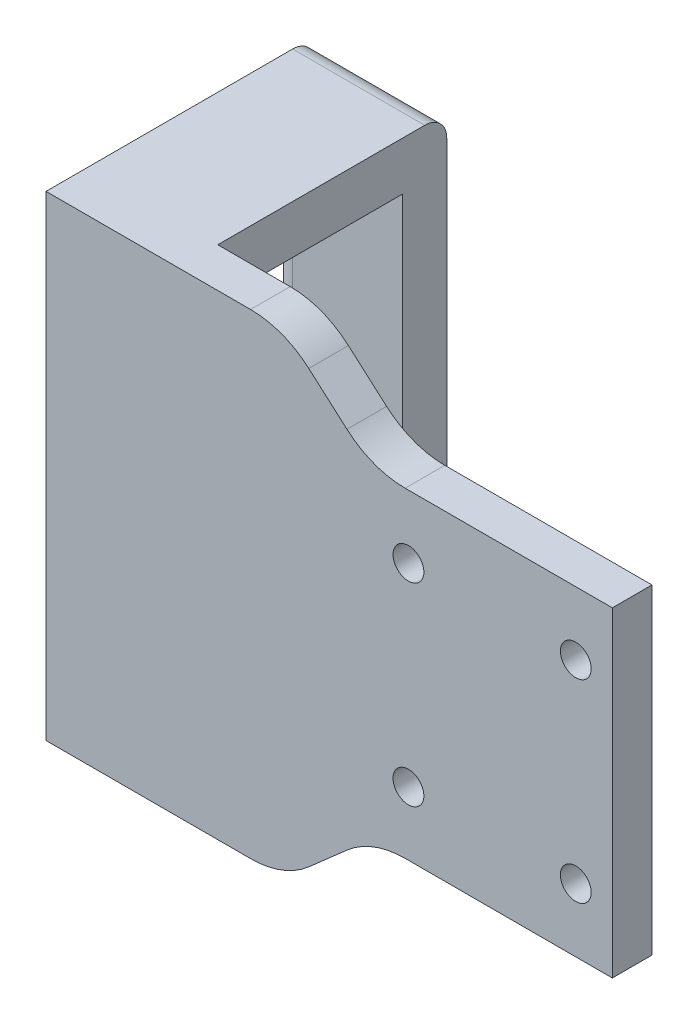
ISO-10303-21;
HEADER;
FILE_DESCRIPTION(('STEP AP214'),'2;1');
FILE_NAME('part.step','',(''),(''),'','','');
FILE_SCHEMA(('AUTOMOTIVE_DESIGN { 1 0 10303 214 1 1 1 1 }'));
ENDSEC;
DATA;
#1=APPLICATION_CONTEXT('core data for automotive mechanical design processes');
#2=APPLICATION_PROTOCOL_DEFINITION('international standard','automotive_design',2000,#1);
#3=PRODUCT_CONTEXT('',#1,'mechanical');
#4=PRODUCT('Part','Part','',(#3));
#5=PRODUCT_RELATED_PRODUCT_CATEGORY('part','',(#4));
#6=PRODUCT_DEFINITION_FORMATION('','',#4);
#7=PRODUCT_DEFINITION_CONTEXT('part definition',#1,'design');
#8=PRODUCT_DEFINITION('design','',#6,#7);
#9=PRODUCT_DEFINITION_SHAPE('','',#8);
#10=(LENGTH_UNIT() NAMED_UNIT(*) SI_UNIT(.MILLI.,.METRE.));
#11=(NAMED_UNIT(*) PLANE_ANGLE_UNIT() SI_UNIT($,.RADIAN.));
#12=(NAMED_UNIT(*) SI_UNIT($,.STERADIAN.) SOLID_ANGLE_UNIT());
#13=UNCERTAINTY_MEASURE_WITH_UNIT(LENGTH_MEASURE(1.E-05),#10,'distance_accuracy_value','');
#14=(GEOMETRIC_REPRESENTATION_CONTEXT(3) GLOBAL_UNCERTAINTY_ASSIGNED_CONTEXT((#13)) GLOBAL_UNIT_ASSIGNED_CONTEXT((#10,
#11,#12)) REPRESENTATION_CONTEXT('',''));
#15=CARTESIAN_POINT('',(0.,0.,0.));
#16=DIRECTION('',(0.,0.,1.));
#17=DIRECTION('',(1.,0.,0.));
#18=AXIS2_PLACEMENT_3D('',#15,#16,#17);
#19=CARTESIAN_POINT('',(-98.5039444560216,-21.5,-21.));
#20=DIRECTION('',(0.,-1.,0.));
#21=DIRECTION('',(0.,0.,-1.));
#22=AXIS2_PLACEMENT_3D('',#19,#20,#21);
#23=PLANE('',#22);
#24=DIRECTION('',(0.,0.,-1.));
#25=VECTOR('',#24,1.);
#26=CARTESIAN_POINT('',(-35.65,-21.5,-21.));
#27=LINE('',#26,#25);
#28=CARTESIAN_POINT('',(-35.65,-21.5,0.));
#29=VERTEX_POINT('',#28);
#30=CARTESIAN_POINT('',(-35.65,-21.5,-5.5));
#31=VERTEX_POINT('',#30);
#32=EDGE_CURVE('E211',#29,#31,#27,.T.);
#33=ORIENTED_EDGE('',*,*,#32,.T.);
#34=DIRECTION('',(-1.,0.,0.));
#35=VECTOR('',#34,1.);
#36=CARTESIAN_POINT('',(-25.4,-21.5,-5.5));
#37=LINE('',#36,#35);
#38=CARTESIAN_POINT('',(-50.65,-21.5,-5.5));
#39=VERTEX_POINT('',#38);
#40=EDGE_CURVE('E198',#31,#39,#37,.T.);
#41=ORIENTED_EDGE('',*,*,#40,.T.);
#42=DIRECTION('',(0.,0.,1.));
#43=VECTOR('',#42,1.);
#44=CARTESIAN_POINT('',(-50.65,-21.5,-21.));
#45=LINE('',#44,#43);
#46=CARTESIAN_POINT('',(-50.65,-21.5,2.5));
#47=VERTEX_POINT('',#46);
#48=EDGE_CURVE('E208',#39,#47,#45,.T.);
#49=ORIENTED_EDGE('',*,*,#48,.T.);
#50=CARTESIAN_POINT('',(-48.15,-21.5,2.5));
#51=DIRECTION('',(0.,-1.,0.));
#52=DIRECTION('',(0.,0.,-1.));
#53=AXIS2_PLACEMENT_3D('',#50,#51,#52);
#54=CIRCLE('',#53,2.5);
#55=CARTESIAN_POINT('',(-48.15,-21.5,0.));
#56=VERTEX_POINT('',#55);
#57=EDGE_CURVE('E11',#47,#56,#54,.T.);
#58=ORIENTED_EDGE('',*,*,#57,.T.);
#59=DIRECTION('',(1.,0.,0.));
#60=VECTOR('',#59,1.);
#61=CARTESIAN_POINT('',(-98.5039444560216,-21.5,0.));
#62=LINE('',#61,#60);
#63=EDGE_CURVE('E226',#56,#29,#62,.T.);
#64=ORIENTED_EDGE('',*,*,#63,.T.);
#65=EDGE_LOOP('',(#33,#41,#49,#58,#64));
#66=FACE_BOUND('',#65,.T.);
#67=ADVANCED_FACE('F35',(#66),#23,.F.);
#68=CARTESIAN_POINT('',(0.,0.,4.5));
#69=DIRECTION('',(0.,0.,-1.));
#70=DIRECTION('',(-1.,0.,0.));
#71=AXIS2_PLACEMENT_3D('',#68,#69,#70);
#72=PLANE('',#71);
#73=DIRECTION('',(1.,0.,0.));
#74=VECTOR('',#73,1.);
#75=CARTESIAN_POINT('',(-23.65,-27.,4.5));
#76=LINE('',#75,#74);
#77=CARTESIAN_POINT('',(-50.65,-27.,4.5));
#78=VERTEX_POINT('',#77);
#79=CARTESIAN_POINT('',(-27.4234780048606,-27.,4.5));
#80=VERTEX_POINT('',#79);
#81=EDGE_CURVE('E280',#78,#80,#76,.T.);
#82=ORIENTED_EDGE('',*,*,#81,.T.);
#83=CARTESIAN_POINT('',(-27.4234780048606,-17.,4.5));
#84=DIRECTION('',(0.,0.,-1.));
#85=DIRECTION('',(-1.,0.,0.));
#86=AXIS2_PLACEMENT_3D('',#83,#84,#85);
#87=CIRCLE('',#86,10.);
#88=CARTESIAN_POINT('',(-20.8171990559404,-24.5071351692275,4.5));
#89=VERTEX_POINT('',#88);
#90=EDGE_CURVE('E330',#80,#89,#87,.F.);
#91=ORIENTED_EDGE('',*,*,#90,.T.);
#92=DIRECTION('',(0.750713516922756,0.660627894892024,0.));
#93=VECTOR('',#92,1.);
#94=CARTESIAN_POINT('',(-13.65,-18.2,4.5));
#95=LINE('',#94,#93);
#96=CARTESIAN_POINT('',(-16.4828009440596,-20.6928648307724,4.5));
#97=VERTEX_POINT('',#96);
#98=EDGE_CURVE('E283',#89,#97,#95,.T.);
#99=ORIENTED_EDGE('',*,*,#98,.T.);
#100=CARTESIAN_POINT('',(-9.87652199513936,-28.2,4.5));
#101=DIRECTION('',(0.,0.,-1.));
#102=DIRECTION('',(-1.,0.,0.));
#103=AXIS2_PLACEMENT_3D('',#100,#101,#102);
#104=CIRCLE('',#103,10.);
#105=CARTESIAN_POINT('',(-9.87652199513936,-18.2,4.5));
#106=VERTEX_POINT('',#105);
#107=EDGE_CURVE('E347',#97,#106,#104,.T.);
#108=ORIENTED_EDGE('',*,*,#107,.T.);
#109=DIRECTION('',(1.,0.,0.));
#110=VECTOR('',#109,1.);
#111=CARTESIAN_POINT('',(-13.65,-18.2,4.5));
#112=LINE('',#111,#110);
#113=CARTESIAN_POINT('',(13.65,-18.2,4.5));
#114=VERTEX_POINT('',#113);
#115=EDGE_CURVE('E286',#106,#114,#112,.T.);
#116=ORIENTED_EDGE('',*,*,#115,.T.);
#117=DIRECTION('',(0.,1.,0.));
#118=VECTOR('',#117,1.);
#119=CARTESIAN_POINT('',(13.65,-18.2,4.5));
#120=LINE('',#119,#118);
#121=CARTESIAN_POINT('',(13.65,18.2,4.5));
#122=VERTEX_POINT('',#121);
#123=EDGE_CURVE('E266',#114,#122,#120,.T.);
#124=ORIENTED_EDGE('',*,*,#123,.T.);
#125=DIRECTION('',(-1.,0.,0.));
#126=VECTOR('',#125,1.);
#127=CARTESIAN_POINT('',(-13.65,18.2,4.5));
#128=LINE('',#127,#126);
#129=CARTESIAN_POINT('',(-9.87652199513936,18.2,4.5));
#130=VERTEX_POINT('',#129);
#131=EDGE_CURVE('E269',#122,#130,#128,.T.);
#132=ORIENTED_EDGE('',*,*,#131,.T.);
#133=CARTESIAN_POINT('',(-9.87652199513936,28.2,4.5));
#134=DIRECTION('',(0.,0.,-1.));
#135=DIRECTION('',(-1.,0.,0.));
#136=AXIS2_PLACEMENT_3D('',#133,#134,#135);
#137=CIRCLE('',#136,10.);
#138=CARTESIAN_POINT('',(-16.4828009440596,20.6928648307725,4.5));
#139=VERTEX_POINT('',#138);
#140=EDGE_CURVE('E351',#130,#139,#137,.T.);
#141=ORIENTED_EDGE('',*,*,#140,.T.);
#142=DIRECTION('',(-0.750713516922755,0.660627894892025,0.));
#143=VECTOR('',#142,1.);
#144=CARTESIAN_POINT('',(-13.65,18.2,4.5));
#145=LINE('',#144,#143);
#146=CARTESIAN_POINT('',(-20.8171990559404,24.5071351692276,4.5));
#147=VERTEX_POINT('',#146);
#148=EDGE_CURVE('E273',#139,#147,#145,.T.);
#149=ORIENTED_EDGE('',*,*,#148,.T.);
#150=CARTESIAN_POINT('',(-27.4234780048607,17.,4.5));
#151=DIRECTION('',(0.,0.,-1.));
#152=DIRECTION('',(-1.,0.,0.));
#153=AXIS2_PLACEMENT_3D('',#150,#151,#152);
#154=CIRCLE('',#153,10.);
#155=CARTESIAN_POINT('',(-27.4234780048607,27.,4.5));
#156=VERTEX_POINT('',#155);
#157=EDGE_CURVE('E328',#147,#156,#154,.F.);
#158=ORIENTED_EDGE('',*,*,#157,.T.);
#159=DIRECTION('',(-1.,0.,0.));
#160=VECTOR('',#159,1.);
#161=CARTESIAN_POINT('',(-23.65,27.,4.5));
#162=LINE('',#161,#160);
#163=CARTESIAN_POINT('',(-50.65,27.,4.5));
#164=VERTEX_POINT('',#163);
#165=EDGE_CURVE('E276',#156,#164,#162,.T.);
#166=ORIENTED_EDGE('',*,*,#165,.T.);
#167=DIRECTION('',(0.,-1.,0.));
#168=VECTOR('',#167,1.);
#169=CARTESIAN_POINT('',(-50.65,27.,4.5));
#170=LINE('',#169,#168);
#171=EDGE_CURVE('E278',#164,#78,#170,.T.);
#172=ORIENTED_EDGE('',*,*,#171,.T.);
#173=EDGE_LOOP('',(#82,#91,#99,#108,#116,#124,#132,#141,#149,#158,#166,#172));
#174=FACE_BOUND('',#173,.T.);
#175=CARTESIAN_POINT('',(-9.5,11.,4.5));
#176=DIRECTION('',(0.,0.,1.));
#177=DIRECTION('',(1.,0.,0.));
#178=AXIS2_PLACEMENT_3D('',#175,#176,#177);
#179=CIRCLE('',#178,1.75);
#180=CARTESIAN_POINT('',(-7.75,11.,4.5));
#181=VERTEX_POINT('',#180);
#182=EDGE_CURVE('E260',#181,#181,#179,.T.);
#183=ORIENTED_EDGE('',*,*,#182,.F.);
#184=EDGE_LOOP('',(#183));
#185=FACE_BOUND('',#184,.T.);
#186=CARTESIAN_POINT('',(9.49999999999999,11.,4.5));
#187=DIRECTION('',(0.,0.,1.));
#188=DIRECTION('',(-1.,0.,0.));
#189=AXIS2_PLACEMENT_3D('',#186,#187,#188);
#190=CIRCLE('',#189,1.75);
#191=CARTESIAN_POINT('',(7.74999999999999,11.,4.5));
#192=VERTEX_POINT('',#191);
#193=EDGE_CURVE('E254',#192,#192,#190,.T.);
#194=ORIENTED_EDGE('',*,*,#193,.F.);
#195=EDGE_LOOP('',(#194));
#196=FACE_BOUND('',#195,.T.);
#197=CARTESIAN_POINT('',(-9.5,-11.,4.5));
#198=DIRECTION('',(0.,0.,1.));
#199=DIRECTION('',(-1.,0.,0.));
#200=AXIS2_PLACEMENT_3D('',#197,#198,#199);
#201=CIRCLE('',#200,1.75);
#202=CARTESIAN_POINT('',(-11.25,-11.,4.5));
#203=VERTEX_POINT('',#202);
#204=EDGE_CURVE('E248',#203,#203,#201,.T.);
#205=ORIENTED_EDGE('',*,*,#204,.F.);
#206=EDGE_LOOP('',(#205));
#207=FACE_BOUND('',#206,.T.);
#208=CARTESIAN_POINT('',(9.49999999999999,-11.,4.5));
#209=DIRECTION('',(0.,0.,1.));
#210=DIRECTION('',(1.,0.,0.));
#211=AXIS2_PLACEMENT_3D('',#208,#209,#210);
#212=CIRCLE('',#211,1.75);
#213=CARTESIAN_POINT('',(11.25,-11.,4.5));
#214=VERTEX_POINT('',#213);
#215=EDGE_CURVE('E242',#214,#214,#212,.T.);
#216=ORIENTED_EDGE('',*,*,#215,.F.);
#217=EDGE_LOOP('',(#216));
#218=FACE_BOUND('',#217,.T.);
#219=ADVANCED_FACE('F437',(#174,#185,#196,#207,#218),#72,.F.);
#220=CARTESIAN_POINT('',(0.,0.,0.));
#221=DIRECTION('',(0.,0.,-1.));
#222=DIRECTION('',(-1.,0.,0.));
#223=AXIS2_PLACEMENT_3D('',#220,#221,#222);
#224=PLANE('',#223);
#225=ORIENTED_EDGE('',*,*,#63,.F.);
#226=DIRECTION('',(0.,1.,0.));
#227=VECTOR('',#226,1.);
#228=CARTESIAN_POINT('',(-48.15,21.5,0.));
#229=LINE('',#228,#227);
#230=CARTESIAN_POINT('',(-48.15,21.5,0.));
#231=VERTEX_POINT('',#230);
#232=EDGE_CURVE('E364',#56,#231,#229,.T.);
#233=ORIENTED_EDGE('',*,*,#232,.T.);
#234=DIRECTION('',(1.,0.,0.));
#235=VECTOR('',#234,1.);
#236=CARTESIAN_POINT('',(-98.5039444560216,21.5,0.));
#237=LINE('',#236,#235);
#238=CARTESIAN_POINT('',(-35.65,21.5,0.));
#239=VERTEX_POINT('',#238);
#240=EDGE_CURVE('E222',#231,#239,#237,.T.);
#241=ORIENTED_EDGE('',*,*,#240,.T.);
#242=DIRECTION('',(0.,-1.,0.));
#243=VECTOR('',#242,1.);
#244=CARTESIAN_POINT('',(-35.65,27.,0.));
#245=LINE('',#244,#243);
#246=CARTESIAN_POINT('',(-35.65,27.,0.));
#247=VERTEX_POINT('',#246);
#248=EDGE_CURVE('E232',#247,#239,#245,.T.);
#249=ORIENTED_EDGE('',*,*,#248,.F.);
#250=DIRECTION('',(-1.,0.,0.));
#251=VECTOR('',#250,1.);
#252=CARTESIAN_POINT('',(-23.65,27.,0.));
#253=LINE('',#252,#251);
#254=CARTESIAN_POINT('',(-27.4234780048607,27.,0.));
#255=VERTEX_POINT('',#254);
#256=EDGE_CURVE('E297',#255,#247,#253,.T.);
#257=ORIENTED_EDGE('',*,*,#256,.F.);
#258=CARTESIAN_POINT('',(-27.4234780048607,17.,0.));
#259=DIRECTION('',(0.,0.,-1.));
#260=DIRECTION('',(-1.,0.,0.));
#261=AXIS2_PLACEMENT_3D('',#258,#259,#260);
#262=CIRCLE('',#261,10.);
#263=CARTESIAN_POINT('',(-20.8171990559404,24.5071351692276,0.));
#264=VERTEX_POINT('',#263);
#265=EDGE_CURVE('E322',#255,#264,#262,.T.);
#266=ORIENTED_EDGE('',*,*,#265,.T.);
#267=DIRECTION('',(-0.750713516922755,0.660627894892025,0.));
#268=VECTOR('',#267,1.);
#269=CARTESIAN_POINT('',(-13.65,18.2,0.));
#270=LINE('',#269,#268);
#271=CARTESIAN_POINT('',(-16.4828009440596,20.6928648307725,0.));
#272=VERTEX_POINT('',#271);
#273=EDGE_CURVE('E294',#272,#264,#270,.T.);
#274=ORIENTED_EDGE('',*,*,#273,.F.);
#275=CARTESIAN_POINT('',(-9.87652199513936,28.2,0.));
#276=DIRECTION('',(0.,0.,-1.));
#277=DIRECTION('',(-1.,0.,0.));
#278=AXIS2_PLACEMENT_3D('',#275,#276,#277);
#279=CIRCLE('',#278,10.);
#280=CARTESIAN_POINT('',(-9.87652199513936,18.2,0.));
#281=VERTEX_POINT('',#280);
#282=EDGE_CURVE('E349',#272,#281,#279,.F.);
#283=ORIENTED_EDGE('',*,*,#282,.T.);
#284=DIRECTION('',(-1.,0.,0.));
#285=VECTOR('',#284,1.);
#286=CARTESIAN_POINT('',(-13.65,18.2,0.));
#287=LINE('',#286,#285);
#288=CARTESIAN_POINT('',(13.65,18.2,0.));
#289=VERTEX_POINT('',#288);
#290=EDGE_CURVE('E291',#289,#281,#287,.T.);
#291=ORIENTED_EDGE('',*,*,#290,.F.);
#292=DIRECTION('',(0.,1.,0.));
#293=VECTOR('',#292,1.);
#294=CARTESIAN_POINT('',(13.65,-18.2,0.));
#295=LINE('',#294,#293);
#296=CARTESIAN_POINT('',(13.65,-18.2,0.));
#297=VERTEX_POINT('',#296);
#298=EDGE_CURVE('E263',#297,#289,#295,.T.);
#299=ORIENTED_EDGE('',*,*,#298,.F.);
#300=DIRECTION('',(1.,0.,0.));
#301=VECTOR('',#300,1.);
#302=CARTESIAN_POINT('',(-13.65,-18.2,0.));
#303=LINE('',#302,#301);
#304=CARTESIAN_POINT('',(-9.87652199513936,-18.2,0.));
#305=VERTEX_POINT('',#304);
#306=EDGE_CURVE('E270',#305,#297,#303,.T.);
#307=ORIENTED_EDGE('',*,*,#306,.F.);
#308=CARTESIAN_POINT('',(-9.87652199513936,-28.2,0.));
#309=DIRECTION('',(0.,0.,-1.));
#310=DIRECTION('',(-1.,0.,0.));
#311=AXIS2_PLACEMENT_3D('',#308,#309,#310);
#312=CIRCLE('',#311,10.);
#313=CARTESIAN_POINT('',(-16.4828009440596,-20.6928648307724,0.));
#314=VERTEX_POINT('',#313);
#315=EDGE_CURVE('E345',#305,#314,#312,.F.);
#316=ORIENTED_EDGE('',*,*,#315,.T.);
#317=DIRECTION('',(0.750713516922756,0.660627894892024,0.));
#318=VECTOR('',#317,1.);
#319=CARTESIAN_POINT('',(-13.65,-18.2,0.));
#320=LINE('',#319,#318);
#321=CARTESIAN_POINT('',(-20.8171990559404,-24.5071351692275,0.));
#322=VERTEX_POINT('',#321);
#323=EDGE_CURVE('E303',#322,#314,#320,.T.);
#324=ORIENTED_EDGE('',*,*,#323,.F.);
#325=CARTESIAN_POINT('',(-27.4234780048606,-17.,0.));
#326=DIRECTION('',(0.,0.,-1.));
#327=DIRECTION('',(-1.,0.,0.));
#328=AXIS2_PLACEMENT_3D('',#325,#326,#327);
#329=CIRCLE('',#328,10.);
#330=CARTESIAN_POINT('',(-27.4234780048606,-27.,0.));
#331=VERTEX_POINT('',#330);
#332=EDGE_CURVE('E324',#322,#331,#329,.T.);
#333=ORIENTED_EDGE('',*,*,#332,.T.);
#334=DIRECTION('',(1.,0.,0.));
#335=VECTOR('',#334,1.);
#336=CARTESIAN_POINT('',(-23.65,-27.,0.));
#337=LINE('',#336,#335);
#338=CARTESIAN_POINT('',(-35.65,-27.,0.));
#339=VERTEX_POINT('',#338);
#340=EDGE_CURVE('E300',#339,#331,#337,.T.);
#341=ORIENTED_EDGE('',*,*,#340,.F.);
#342=EDGE_CURVE('E221',#29,#339,#245,.T.);
#343=ORIENTED_EDGE('',*,*,#342,.F.);
#344=EDGE_LOOP('',(#225,#233,#241,#249,#257,#266,#274,#283,#291,#299,#307,#316,#324,#333,#341,#343));
#345=FACE_BOUND('',#344,.T.);
#346=CARTESIAN_POINT('',(-9.5,-11.,0.));
#347=DIRECTION('',(0.,0.,1.));
#348=DIRECTION('',(-1.,0.,0.));
#349=AXIS2_PLACEMENT_3D('',#346,#347,#348);
#350=CIRCLE('',#349,1.75);
#351=CARTESIAN_POINT('',(-11.25,-11.,0.));
#352=VERTEX_POINT('',#351);
#353=EDGE_CURVE('E245',#352,#352,#350,.T.);
#354=ORIENTED_EDGE('',*,*,#353,.T.);
#355=EDGE_LOOP('',(#354));
#356=FACE_BOUND('',#355,.T.);
#357=CARTESIAN_POINT('',(-9.5,11.,0.));
#358=DIRECTION('',(0.,0.,1.));
#359=DIRECTION('',(1.,0.,0.));
#360=AXIS2_PLACEMENT_3D('',#357,#358,#359);
#361=CIRCLE('',#360,1.75);
#362=CARTESIAN_POINT('',(-7.75,11.,0.));
#363=VERTEX_POINT('',#362);
#364=EDGE_CURVE('E257',#363,#363,#361,.T.);
#365=ORIENTED_EDGE('',*,*,#364,.T.);
#366=EDGE_LOOP('',(#365));
#367=FACE_BOUND('',#366,.T.);
#368=CARTESIAN_POINT('',(9.49999999999999,11.,0.));
#369=DIRECTION('',(0.,0.,1.));
#370=DIRECTION('',(-1.,0.,0.));
#371=AXIS2_PLACEMENT_3D('',#368,#369,#370);
#372=CIRCLE('',#371,1.75);
#373=CARTESIAN_POINT('',(7.74999999999999,11.,0.));
#374=VERTEX_POINT('',#373);
#375=EDGE_CURVE('E251',#374,#374,#372,.T.);
#376=ORIENTED_EDGE('',*,*,#375,.T.);
#377=EDGE_LOOP('',(#376));
#378=FACE_BOUND('',#377,.T.);
#379=CARTESIAN_POINT('',(9.49999999999999,-11.,0.));
#380=DIRECTION('',(0.,0.,1.));
#381=DIRECTION('',(1.,0.,0.));
#382=AXIS2_PLACEMENT_3D('',#379,#380,#381);
#383=CIRCLE('',#382,1.75);
#384=CARTESIAN_POINT('',(11.25,-11.,0.));
#385=VERTEX_POINT('',#384);
#386=EDGE_CURVE('E241',#385,#385,#383,.T.);
#387=ORIENTED_EDGE('',*,*,#386,.T.);
#388=EDGE_LOOP('',(#387));
#389=FACE_BOUND('',#388,.T.);
#390=ADVANCED_FACE('F394',(#345,#356,#367,#378,#389),#224,.T.);
#391=CARTESIAN_POINT('',(13.65,-18.2,4.5));
#392=DIRECTION('',(-1.,0.,0.));
#393=DIRECTION('',(0.,0.,1.));
#394=AXIS2_PLACEMENT_3D('',#391,#392,#393);
#395=PLANE('',#394);
#396=ORIENTED_EDGE('',*,*,#298,.T.);
#397=DIRECTION('',(0.,0.,-1.));
#398=VECTOR('',#397,1.);
#399=CARTESIAN_POINT('',(13.65,18.2,4.5));
#400=LINE('',#399,#398);
#401=EDGE_CURVE('E314',#122,#289,#400,.T.);
#402=ORIENTED_EDGE('',*,*,#401,.F.);
#403=ORIENTED_EDGE('',*,*,#123,.F.);
#404=DIRECTION('',(0.,0.,-1.));
#405=VECTOR('',#404,1.);
#406=CARTESIAN_POINT('',(13.65,-18.2,4.5));
#407=LINE('',#406,#405);
#408=EDGE_CURVE('E288',#114,#297,#407,.T.);
#409=ORIENTED_EDGE('',*,*,#408,.T.);
#410=EDGE_LOOP('',(#396,#402,#403,#409));
#411=FACE_BOUND('',#410,.T.);
#412=ADVANCED_FACE('F449',(#411),#395,.F.);
#413=CARTESIAN_POINT('',(-13.65,18.2,4.5));
#414=DIRECTION('',(0.,-1.,0.));
#415=DIRECTION('',(0.,0.,-1.));
#416=AXIS2_PLACEMENT_3D('',#413,#414,#415);
#417=PLANE('',#416);
#418=ORIENTED_EDGE('',*,*,#290,.T.);
#419=DIRECTION('',(0.,0.,-1.));
#420=VECTOR('',#419,1.);
#421=CARTESIAN_POINT('',(-9.87652199513936,18.2,4.5));
#422=LINE('',#421,#420);
#423=EDGE_CURVE('E343',#281,#130,#422,.F.);
#424=ORIENTED_EDGE('',*,*,#423,.T.);
#425=ORIENTED_EDGE('',*,*,#131,.F.);
#426=ORIENTED_EDGE('',*,*,#401,.T.);
#427=EDGE_LOOP('',(#418,#424,#425,#426));
#428=FACE_BOUND('',#427,.T.);
#429=ADVANCED_FACE('F445',(#428),#417,.F.);
#430=CARTESIAN_POINT('',(-13.65,18.2,4.5));
#431=DIRECTION('',(-0.660627894892025,-0.750713516922755,0.));
#432=DIRECTION('',(0.750713516922755,-0.660627894892025,0.));
#433=AXIS2_PLACEMENT_3D('',#430,#431,#432);
#434=PLANE('',#433);
#435=ORIENTED_EDGE('',*,*,#273,.T.);
#436=DIRECTION('',(0.,0.,-1.));
#437=VECTOR('',#436,1.);
#438=CARTESIAN_POINT('',(-20.8171990559404,24.5071351692276,4.5));
#439=LINE('',#438,#437);
#440=EDGE_CURVE('E338',#264,#147,#439,.F.);
#441=ORIENTED_EDGE('',*,*,#440,.T.);
#442=ORIENTED_EDGE('',*,*,#148,.F.);
#443=DIRECTION('',(0.,0.,-1.));
#444=VECTOR('',#443,1.);
#445=CARTESIAN_POINT('',(-16.4828009440596,20.6928648307725,0.));
#446=LINE('',#445,#444);
#447=EDGE_CURVE('E335',#139,#272,#446,.T.);
#448=ORIENTED_EDGE('',*,*,#447,.T.);
#449=EDGE_LOOP('',(#435,#441,#442,#448));
#450=FACE_BOUND('',#449,.T.);
#451=ADVANCED_FACE('F434',(#450),#434,.F.);
#452=CARTESIAN_POINT('',(-23.65,27.,4.5));
#453=DIRECTION('',(0.,-1.,0.));
#454=DIRECTION('',(1.,0.,0.));
#455=AXIS2_PLACEMENT_3D('',#452,#453,#454);
#456=PLANE('',#455);
#457=DIRECTION('',(0.,0.,1.));
#458=VECTOR('',#457,1.);
#459=CARTESIAN_POINT('',(-35.65,27.,-26.));
#460=LINE('',#459,#458);
#461=CARTESIAN_POINT('',(-35.65,27.,-23.5));
#462=VERTEX_POINT('',#461);
#463=EDGE_CURVE('E239',#462,#247,#460,.T.);
#464=ORIENTED_EDGE('',*,*,#463,.F.);
#465=DIRECTION('',(1.,0.,0.));
#466=VECTOR('',#465,1.);
#467=CARTESIAN_POINT('',(-23.65,27.,-23.5));
#468=LINE('',#467,#466);
#469=CARTESIAN_POINT('',(-50.65,27.,-23.5));
#470=VERTEX_POINT('',#469);
#471=EDGE_CURVE('E376',#462,#470,#468,.F.);
#472=ORIENTED_EDGE('',*,*,#471,.T.);
#473=DIRECTION('',(0.,0.,-1.));
#474=VECTOR('',#473,1.);
#475=CARTESIAN_POINT('',(-50.65,27.,4.5));
#476=LINE('',#475,#474);
#477=EDGE_CURVE('E311',#164,#470,#476,.T.);
#478=ORIENTED_EDGE('',*,*,#477,.F.);
#479=ORIENTED_EDGE('',*,*,#165,.F.);
#480=DIRECTION('',(0.,0.,-1.));
#481=VECTOR('',#480,1.);
#482=CARTESIAN_POINT('',(-27.4234780048607,27.,4.5));
#483=LINE('',#482,#481);
#484=EDGE_CURVE('E332',#156,#255,#483,.T.);
#485=ORIENTED_EDGE('',*,*,#484,.T.);
#486=ORIENTED_EDGE('',*,*,#256,.T.);
#487=EDGE_LOOP('',(#464,#472,#478,#479,#485,#486));
#488=FACE_BOUND('',#487,.T.);
#489=ADVANCED_FACE('F423',(#488),#456,.F.);
#490=CARTESIAN_POINT('',(-50.65,27.,4.5));
#491=DIRECTION('',(1.,0.,0.));
#492=DIRECTION('',(0.,0.,-1.));
#493=AXIS2_PLACEMENT_3D('',#490,#491,#492);
#494=PLANE('',#493);
#495=CARTESIAN_POINT('',(-50.65,-24.75,-15.5));
#496=DIRECTION('',(-1.,0.,0.));
#497=DIRECTION('',(0.,0.,-1.));
#498=AXIS2_PLACEMENT_3D('',#495,#496,#497);
#499=CIRCLE('',#498,1.35);
#500=CARTESIAN_POINT('',(-50.65,-24.75,-16.85));
#501=VERTEX_POINT('',#500);
#502=EDGE_CURVE('E482',#501,#501,#499,.T.);
#503=ORIENTED_EDGE('',*,*,#502,.F.);
#504=EDGE_LOOP('',(#503));
#505=FACE_BOUND('',#504,.T.);
#506=CARTESIAN_POINT('',(-50.65,-24.75,-5.50000000000001));
#507=DIRECTION('',(-1.,0.,0.));
#508=DIRECTION('',(0.,0.,1.));
#509=AXIS2_PLACEMENT_3D('',#506,#507,#508);
#510=CIRCLE('',#509,1.35);
#511=CARTESIAN_POINT('',(-50.65,-24.75,-4.15000000000001));
#512=VERTEX_POINT('',#511);
#513=EDGE_CURVE('E488',#512,#512,#510,.T.);
#514=ORIENTED_EDGE('',*,*,#513,.F.);
#515=EDGE_LOOP('',(#514));
#516=FACE_BOUND('',#515,.T.);
#517=CARTESIAN_POINT('',(-50.65,24.75,-5.50000000000001));
#518=DIRECTION('',(-1.,0.,0.));
#519=DIRECTION('',(0.,0.,-1.));
#520=AXIS2_PLACEMENT_3D('',#517,#518,#519);
#521=CIRCLE('',#520,1.35);
#522=CARTESIAN_POINT('',(-50.65,24.75,-6.85));
#523=VERTEX_POINT('',#522);
#524=EDGE_CURVE('E494',#523,#523,#521,.T.);
#525=ORIENTED_EDGE('',*,*,#524,.F.);
#526=EDGE_LOOP('',(#525));
#527=FACE_BOUND('',#526,.T.);
#528=CARTESIAN_POINT('',(-50.65,24.75,-15.5));
#529=DIRECTION('',(-1.,0.,0.));
#530=DIRECTION('',(0.,0.,1.));
#531=AXIS2_PLACEMENT_3D('',#528,#529,#530);
#532=CIRCLE('',#531,1.35);
#533=CARTESIAN_POINT('',(-50.65,24.75,-14.15));
#534=VERTEX_POINT('',#533);
#535=EDGE_CURVE('E476',#534,#534,#532,.T.);
#536=ORIENTED_EDGE('',*,*,#535,.F.);
#537=EDGE_LOOP('',(#536));
#538=FACE_BOUND('',#537,.T.);
#539=CARTESIAN_POINT('',(-50.65,-21.5,-23.5));
#540=VERTEX_POINT('',#539);
#541=CARTESIAN_POINT('',(-50.65,-21.5,-15.5));
#542=VERTEX_POINT('',#541);
#543=EDGE_CURVE('E218',#540,#542,#45,.T.);
#544=ORIENTED_EDGE('',*,*,#543,.F.);
#545=DIRECTION('',(0.,-1.,0.));
#546=VECTOR('',#545,1.);
#547=CARTESIAN_POINT('',(-50.65,27.,-23.5));
#548=LINE('',#547,#546);
#549=CARTESIAN_POINT('',(-50.65,21.5,-23.5));
#550=VERTEX_POINT('',#549);
#551=EDGE_CURVE('E361',#540,#550,#548,.F.);
#552=ORIENTED_EDGE('',*,*,#551,.T.);
#553=DIRECTION('',(0.,0.,-1.));
#554=VECTOR('',#553,1.);
#555=CARTESIAN_POINT('',(-50.65,21.5,-21.));
#556=LINE('',#555,#554);
#557=CARTESIAN_POINT('',(-50.65,21.5,2.5));
#558=VERTEX_POINT('',#557);
#559=EDGE_CURVE('E219',#558,#550,#556,.T.);
#560=ORIENTED_EDGE('',*,*,#559,.F.);
#561=DIRECTION('',(0.,1.,0.));
#562=VECTOR('',#561,1.);
#563=CARTESIAN_POINT('',(-50.65,-21.5,2.5));
#564=LINE('',#563,#562);
#565=EDGE_CURVE('E216',#558,#47,#564,.F.);
#566=ORIENTED_EDGE('',*,*,#565,.T.);
#567=ORIENTED_EDGE('',*,*,#48,.F.);
#568=CARTESIAN_POINT('',(-50.65,-17.0694444444444,-10.5));
#569=DIRECTION('',(-1.,0.,0.));
#570=DIRECTION('',(0.,0.,1.));
#571=AXIS2_PLACEMENT_3D('',#568,#569,#570);
#572=CIRCLE('',#571,6.68055555555555);
#573=EDGE_CURVE('E195',#542,#39,#572,.T.);
#574=ORIENTED_EDGE('',*,*,#573,.F.);
#575=EDGE_LOOP('',(#544,#552,#560,#566,#567,#574));
#576=FACE_BOUND('',#575,.T.);
#577=ORIENTED_EDGE('',*,*,#477,.T.);
#578=CARTESIAN_POINT('',(-50.65,24.5,-23.5));
#579=DIRECTION('',(1.,0.,0.));
#580=DIRECTION('',(0.,0.,-1.));
#581=AXIS2_PLACEMENT_3D('',#578,#579,#580);
#582=CIRCLE('',#581,2.5);
#583=CARTESIAN_POINT('',(-50.65,24.5,-26.));
#584=VERTEX_POINT('',#583);
#585=EDGE_CURVE('E358',#470,#584,#582,.F.);
#586=ORIENTED_EDGE('',*,*,#585,.T.);
#587=DIRECTION('',(0.,1.,0.));
#588=VECTOR('',#587,1.);
#589=CARTESIAN_POINT('',(-50.65,27.,-26.));
#590=LINE('',#589,#588);
#591=CARTESIAN_POINT('',(-50.65,-24.5,-26.));
#592=VERTEX_POINT('',#591);
#593=EDGE_CURVE('E228',#592,#584,#590,.T.);
#594=ORIENTED_EDGE('',*,*,#593,.F.);
#595=CARTESIAN_POINT('',(-50.65,-24.5,-23.5));
#596=DIRECTION('',(1.,0.,0.));
#597=DIRECTION('',(0.,0.,-1.));
#598=AXIS2_PLACEMENT_3D('',#595,#596,#597);
#599=CIRCLE('',#598,2.5);
#600=CARTESIAN_POINT('',(-50.65,-27.,-23.5));
#601=VERTEX_POINT('',#600);
#602=EDGE_CURVE('E356',#592,#601,#599,.F.);
#603=ORIENTED_EDGE('',*,*,#602,.T.);
#604=DIRECTION('',(0.,0.,-1.));
#605=VECTOR('',#604,1.);
#606=CARTESIAN_POINT('',(-50.65,-27.,4.5));
#607=LINE('',#606,#605);
#608=EDGE_CURVE('E309',#78,#601,#607,.T.);
#609=ORIENTED_EDGE('',*,*,#608,.F.);
#610=ORIENTED_EDGE('',*,*,#171,.F.);
#611=EDGE_LOOP('',(#577,#586,#594,#603,#609,#610));
#612=FACE_BOUND('',#611,.T.);
#613=ADVANCED_FACE('F213',(#505,#516,#527,#538,#576,#612),#494,.F.);
#614=CARTESIAN_POINT('',(-23.65,-27.,4.5));
#615=DIRECTION('',(0.,1.,0.));
#616=DIRECTION('',(-1.,0.,0.));
#617=AXIS2_PLACEMENT_3D('',#614,#615,#616);
#618=PLANE('',#617);
#619=ORIENTED_EDGE('',*,*,#608,.T.);
#620=DIRECTION('',(-1.,0.,0.));
#621=VECTOR('',#620,1.);
#622=CARTESIAN_POINT('',(-23.65,-27.,-23.5));
#623=LINE('',#622,#621);
#624=CARTESIAN_POINT('',(-35.65,-27.,-23.5));
#625=VERTEX_POINT('',#624);
#626=EDGE_CURVE('E58',#601,#625,#623,.F.);
#627=ORIENTED_EDGE('',*,*,#626,.T.);
#628=DIRECTION('',(0.,0.,1.));
#629=VECTOR('',#628,1.);
#630=CARTESIAN_POINT('',(-35.65,-27.,-26.));
#631=LINE('',#630,#629);
#632=EDGE_CURVE('E235',#625,#339,#631,.T.);
#633=ORIENTED_EDGE('',*,*,#632,.T.);
#634=ORIENTED_EDGE('',*,*,#340,.T.);
#635=DIRECTION('',(0.,0.,-1.));
#636=VECTOR('',#635,1.);
#637=CARTESIAN_POINT('',(-27.4234780048606,-27.,4.5));
#638=LINE('',#637,#636);
#639=EDGE_CURVE('E326',#331,#80,#638,.F.);
#640=ORIENTED_EDGE('',*,*,#639,.T.);
#641=ORIENTED_EDGE('',*,*,#81,.F.);
#642=EDGE_LOOP('',(#619,#627,#633,#634,#640,#641));
#643=FACE_BOUND('',#642,.T.);
#644=ADVANCED_FACE('F470',(#643),#618,.F.);
#645=CARTESIAN_POINT('',(-13.65,-18.2,4.5));
#646=DIRECTION('',(-0.660627894892024,0.750713516922756,0.));
#647=DIRECTION('',(-0.750713516922756,-0.660627894892024,0.));
#648=AXIS2_PLACEMENT_3D('',#645,#646,#647);
#649=PLANE('',#648);
#650=ORIENTED_EDGE('',*,*,#98,.F.);
#651=DIRECTION('',(0.,0.,-1.));
#652=VECTOR('',#651,1.);
#653=CARTESIAN_POINT('',(-20.8171990559404,-24.5071351692275,4.5));
#654=LINE('',#653,#652);
#655=EDGE_CURVE('E319',#89,#322,#654,.T.);
#656=ORIENTED_EDGE('',*,*,#655,.T.);
#657=ORIENTED_EDGE('',*,*,#323,.T.);
#658=DIRECTION('',(0.,0.,-1.));
#659=VECTOR('',#658,1.);
#660=CARTESIAN_POINT('',(-16.4828009440596,-20.6928648307724,4.5));
#661=LINE('',#660,#659);
#662=EDGE_CURVE('E317',#314,#97,#661,.F.);
#663=ORIENTED_EDGE('',*,*,#662,.T.);
#664=EDGE_LOOP('',(#650,#656,#657,#663));
#665=FACE_BOUND('',#664,.T.);
#666=ADVANCED_FACE('F463',(#665),#649,.F.);
#667=CARTESIAN_POINT('',(-13.65,-18.2,4.5));
#668=DIRECTION('',(0.,1.,0.));
#669=DIRECTION('',(0.,0.,1.));
#670=AXIS2_PLACEMENT_3D('',#667,#668,#669);
#671=PLANE('',#670);
#672=ORIENTED_EDGE('',*,*,#115,.F.);
#673=DIRECTION('',(0.,0.,-1.));
#674=VECTOR('',#673,1.);
#675=CARTESIAN_POINT('',(-9.87652199513936,-18.2,0.));
#676=LINE('',#675,#674);
#677=EDGE_CURVE('E340',#106,#305,#676,.T.);
#678=ORIENTED_EDGE('',*,*,#677,.T.);
#679=ORIENTED_EDGE('',*,*,#306,.T.);
#680=ORIENTED_EDGE('',*,*,#408,.F.);
#681=EDGE_LOOP('',(#672,#678,#679,#680));
#682=FACE_BOUND('',#681,.T.);
#683=ADVANCED_FACE('F455',(#682),#671,.F.);
#684=CARTESIAN_POINT('',(-9.5,11.,4.5));
#685=DIRECTION('',(0.,0.,-1.));
#686=DIRECTION('',(-1.,0.,0.));
#687=AXIS2_PLACEMENT_3D('',#684,#685,#686);
#688=CYLINDRICAL_SURFACE('',#687,1.75);
#689=ORIENTED_EDGE('',*,*,#182,.T.);
#690=EDGE_LOOP('',(#689));
#691=FACE_BOUND('',#690,.T.);
#692=ORIENTED_EDGE('',*,*,#364,.F.);
#693=EDGE_LOOP('',(#692));
#694=FACE_BOUND('',#693,.T.);
#695=ADVANCED_FACE('F777',(#691,#694),#688,.F.);
#696=CARTESIAN_POINT('',(9.49999999999999,11.,4.5));
#697=DIRECTION('',(0.,0.,-1.));
#698=DIRECTION('',(-1.,0.,0.));
#699=AXIS2_PLACEMENT_3D('',#696,#697,#698);
#700=CYLINDRICAL_SURFACE('',#699,1.75);
#701=ORIENTED_EDGE('',*,*,#193,.T.);
#702=EDGE_LOOP('',(#701));
#703=FACE_BOUND('',#702,.T.);
#704=ORIENTED_EDGE('',*,*,#375,.F.);
#705=EDGE_LOOP('',(#704));
#706=FACE_BOUND('',#705,.T.);
#707=ADVANCED_FACE('F796',(#703,#706),#700,.F.);
#708=CARTESIAN_POINT('',(-9.5,-11.,4.5));
#709=DIRECTION('',(0.,0.,-1.));
#710=DIRECTION('',(-1.,0.,0.));
#711=AXIS2_PLACEMENT_3D('',#708,#709,#710);
#712=CYLINDRICAL_SURFACE('',#711,1.75);
#713=ORIENTED_EDGE('',*,*,#204,.T.);
#714=EDGE_LOOP('',(#713));
#715=FACE_BOUND('',#714,.T.);
#716=ORIENTED_EDGE('',*,*,#353,.F.);
#717=EDGE_LOOP('',(#716));
#718=FACE_BOUND('',#717,.T.);
#719=ADVANCED_FACE('F804',(#715,#718),#712,.F.);
#720=CARTESIAN_POINT('',(9.49999999999999,-11.,4.5));
#721=DIRECTION('',(0.,0.,-1.));
#722=DIRECTION('',(-1.,0.,0.));
#723=AXIS2_PLACEMENT_3D('',#720,#721,#722);
#724=CYLINDRICAL_SURFACE('',#723,1.75);
#725=ORIENTED_EDGE('',*,*,#215,.T.);
#726=EDGE_LOOP('',(#725));
#727=FACE_BOUND('',#726,.T.);
#728=ORIENTED_EDGE('',*,*,#386,.F.);
#729=EDGE_LOOP('',(#728));
#730=FACE_BOUND('',#729,.T.);
#731=ADVANCED_FACE('F644',(#727,#730),#724,.F.);
#732=CARTESIAN_POINT('',(-35.65,27.,-26.));
#733=DIRECTION('',(-1.,0.,0.));
#734=DIRECTION('',(0.,-1.,0.));
#735=AXIS2_PLACEMENT_3D('',#732,#733,#734);
#736=PLANE('',#735);
#737=DIRECTION('',(0.,-1.,0.));
#738=VECTOR('',#737,1.);
#739=CARTESIAN_POINT('',(-35.65,27.,-26.));
#740=LINE('',#739,#738);
#741=CARTESIAN_POINT('',(-35.65,24.5,-26.));
#742=VERTEX_POINT('',#741);
#743=CARTESIAN_POINT('',(-35.65,-24.5,-26.));
#744=VERTEX_POINT('',#743);
#745=EDGE_CURVE('E231',#742,#744,#740,.T.);
#746=ORIENTED_EDGE('',*,*,#745,.F.);
#747=CARTESIAN_POINT('',(-35.65,24.5,-23.5));
#748=DIRECTION('',(-1.,0.,0.));
#749=DIRECTION('',(0.,-1.,0.));
#750=AXIS2_PLACEMENT_3D('',#747,#748,#749);
#751=CIRCLE('',#750,2.5);
#752=EDGE_CURVE('E50',#742,#462,#751,.F.);
#753=ORIENTED_EDGE('',*,*,#752,.T.);
#754=ORIENTED_EDGE('',*,*,#463,.T.);
#755=ORIENTED_EDGE('',*,*,#248,.T.);
#756=DIRECTION('',(0.,0.,1.));
#757=VECTOR('',#756,1.);
#758=CARTESIAN_POINT('',(-35.65,21.5,-21.));
#759=LINE('',#758,#757);
#760=CARTESIAN_POINT('',(-35.65,21.5,-21.));
#761=VERTEX_POINT('',#760);
#762=EDGE_CURVE('E399',#761,#239,#759,.T.);
#763=ORIENTED_EDGE('',*,*,#762,.F.);
#764=DIRECTION('',(0.,1.,0.));
#765=VECTOR('',#764,1.);
#766=CARTESIAN_POINT('',(-35.65,-21.5,-21.));
#767=LINE('',#766,#765);
#768=CARTESIAN_POINT('',(-35.65,-21.5,-21.));
#769=VERTEX_POINT('',#768);
#770=EDGE_CURVE('E401',#769,#761,#767,.T.);
#771=ORIENTED_EDGE('',*,*,#770,.F.);
#772=CARTESIAN_POINT('',(-35.65,-21.5,-15.5));
#773=VERTEX_POINT('',#772);
#774=EDGE_CURVE('E473',#773,#769,#27,.T.);
#775=ORIENTED_EDGE('',*,*,#774,.F.);
#776=CARTESIAN_POINT('',(-35.65,-17.0694444444444,-10.5));
#777=DIRECTION('',(-1.,0.,0.));
#778=DIRECTION('',(0.,-1.,0.));
#779=AXIS2_PLACEMENT_3D('',#776,#777,#778);
#780=CIRCLE('',#779,6.68055555555555);
#781=EDGE_CURVE('E472',#31,#773,#780,.F.);
#782=ORIENTED_EDGE('',*,*,#781,.F.);
#783=ORIENTED_EDGE('',*,*,#32,.F.);
#784=ORIENTED_EDGE('',*,*,#342,.T.);
#785=ORIENTED_EDGE('',*,*,#632,.F.);
#786=CARTESIAN_POINT('',(-35.65,-24.5,-23.5));
#787=DIRECTION('',(-1.,0.,0.));
#788=DIRECTION('',(0.,-1.,0.));
#789=AXIS2_PLACEMENT_3D('',#786,#787,#788);
#790=CIRCLE('',#789,2.5);
#791=EDGE_CURVE('E373',#625,#744,#790,.F.);
#792=ORIENTED_EDGE('',*,*,#791,.T.);
#793=EDGE_LOOP('',(#746,#753,#754,#755,#763,#771,#775,#782,#783,#784,#785,#792));
#794=FACE_BOUND('',#793,.T.);
#795=ADVANCED_FACE('F418',(#794),#736,.F.);
#796=CARTESIAN_POINT('',(0.,0.,-26.));
#797=DIRECTION('',(0.,0.,1.));
#798=DIRECTION('',(1.,0.,0.));
#799=AXIS2_PLACEMENT_3D('',#796,#797,#798);
#800=PLANE('',#799);
#801=ORIENTED_EDGE('',*,*,#593,.T.);
#802=DIRECTION('',(1.,0.,0.));
#803=VECTOR('',#802,1.);
#804=CARTESIAN_POINT('',(0.,24.5,-26.));
#805=LINE('',#804,#803);
#806=EDGE_CURVE('E370',#584,#742,#805,.T.);
#807=ORIENTED_EDGE('',*,*,#806,.T.);
#808=ORIENTED_EDGE('',*,*,#745,.T.);
#809=DIRECTION('',(-1.,0.,0.));
#810=VECTOR('',#809,1.);
#811=CARTESIAN_POINT('',(0.,-24.5,-26.));
#812=LINE('',#811,#810);
#813=EDGE_CURVE('E367',#744,#592,#812,.T.);
#814=ORIENTED_EDGE('',*,*,#813,.T.);
#815=EDGE_LOOP('',(#801,#807,#808,#814));
#816=FACE_BOUND('',#815,.T.);
#817=ADVANCED_FACE('F534',(#816),#800,.F.);
#818=CARTESIAN_POINT('',(-98.5039444560216,21.5,-21.));
#819=DIRECTION('',(0.,1.,0.));
#820=DIRECTION('',(0.,0.,1.));
#821=AXIS2_PLACEMENT_3D('',#818,#819,#820);
#822=PLANE('',#821);
#823=ORIENTED_EDGE('',*,*,#559,.T.);
#824=CARTESIAN_POINT('',(-48.15,21.5,-23.5));
#825=DIRECTION('',(0.,1.,0.));
#826=DIRECTION('',(0.,0.,1.));
#827=AXIS2_PLACEMENT_3D('',#824,#825,#826);
#828=CIRCLE('',#827,2.5);
#829=CARTESIAN_POINT('',(-48.15,21.5,-21.));
#830=VERTEX_POINT('',#829);
#831=EDGE_CURVE('E382',#550,#830,#828,.T.);
#832=ORIENTED_EDGE('',*,*,#831,.T.);
#833=DIRECTION('',(1.,0.,0.));
#834=VECTOR('',#833,1.);
#835=CARTESIAN_POINT('',(-98.5039444560216,21.5,-21.));
#836=LINE('',#835,#834);
#837=EDGE_CURVE('E400',#830,#761,#836,.T.);
#838=ORIENTED_EDGE('',*,*,#837,.T.);
#839=ORIENTED_EDGE('',*,*,#762,.T.);
#840=ORIENTED_EDGE('',*,*,#240,.F.);
#841=CARTESIAN_POINT('',(-48.15,21.5,2.5));
#842=DIRECTION('',(0.,1.,0.));
#843=DIRECTION('',(0.,0.,1.));
#844=AXIS2_PLACEMENT_3D('',#841,#842,#843);
#845=CIRCLE('',#844,2.5);
#846=EDGE_CURVE('E43',#231,#558,#845,.T.);
#847=ORIENTED_EDGE('',*,*,#846,.T.);
#848=EDGE_LOOP('',(#823,#832,#838,#839,#840,#847));
#849=FACE_BOUND('',#848,.T.);
#850=ADVANCED_FACE('F386',(#849),#822,.F.);
#851=CARTESIAN_POINT('',(-98.5039444560216,-21.5,-21.));
#852=DIRECTION('',(0.,0.,-1.));
#853=DIRECTION('',(0.,1.,0.));
#854=AXIS2_PLACEMENT_3D('',#851,#852,#853);
#855=PLANE('',#854);
#856=ORIENTED_EDGE('',*,*,#837,.F.);
#857=DIRECTION('',(0.,-1.,0.));
#858=VECTOR('',#857,1.);
#859=CARTESIAN_POINT('',(-48.15,-21.5,-21.));
#860=LINE('',#859,#858);
#861=CARTESIAN_POINT('',(-48.15,-21.5,-21.));
#862=VERTEX_POINT('',#861);
#863=EDGE_CURVE('E353',#830,#862,#860,.T.);
#864=ORIENTED_EDGE('',*,*,#863,.T.);
#865=DIRECTION('',(1.,0.,0.));
#866=VECTOR('',#865,1.);
#867=CARTESIAN_POINT('',(-98.5039444560216,-21.5,-21.));
#868=LINE('',#867,#866);
#869=EDGE_CURVE('E398',#862,#769,#868,.T.);
#870=ORIENTED_EDGE('',*,*,#869,.T.);
#871=ORIENTED_EDGE('',*,*,#770,.T.);
#872=EDGE_LOOP('',(#856,#864,#870,#871));
#873=FACE_BOUND('',#872,.T.);
#874=ADVANCED_FACE('F414',(#873),#855,.F.);
#875=ORIENTED_EDGE('',*,*,#543,.T.);
#876=DIRECTION('',(-1.,0.,0.));
#877=VECTOR('',#876,1.);
#878=CARTESIAN_POINT('',(-25.4,-21.5,-15.5));
#879=LINE('',#878,#877);
#880=EDGE_CURVE('E201',#773,#542,#879,.T.);
#881=ORIENTED_EDGE('',*,*,#880,.F.);
#882=ORIENTED_EDGE('',*,*,#774,.T.);
#883=ORIENTED_EDGE('',*,*,#869,.F.);
#884=CARTESIAN_POINT('',(-48.15,-21.5,-23.5));
#885=DIRECTION('',(0.,-1.,0.));
#886=DIRECTION('',(0.,0.,-1.));
#887=AXIS2_PLACEMENT_3D('',#884,#885,#886);
#888=CIRCLE('',#887,2.5);
#889=EDGE_CURVE('E379',#862,#540,#888,.T.);
#890=ORIENTED_EDGE('',*,*,#889,.T.);
#891=EDGE_LOOP('',(#875,#881,#882,#883,#890));
#892=FACE_BOUND('',#891,.T.);
#893=ADVANCED_FACE('F501',(#892),#23,.F.);
#894=CARTESIAN_POINT('',(-38.65,24.75,-15.5));
#895=DIRECTION('',(-1.,0.,0.));
#896=DIRECTION('',(0.,0.,1.));
#897=AXIS2_PLACEMENT_3D('',#894,#895,#896);
#898=CYLINDRICAL_SURFACE('',#897,1.35);
#899=CARTESIAN_POINT('',(-38.65,24.75,-15.5));
#900=DIRECTION('',(-1.,0.,0.));
#901=DIRECTION('',(0.,0.,1.));
#902=AXIS2_PLACEMENT_3D('',#899,#900,#901);
#903=CIRCLE('',#902,1.35);
#904=CARTESIAN_POINT('',(-38.65,24.75,-14.15));
#905=VERTEX_POINT('',#904);
#906=EDGE_CURVE('E474',#905,#905,#903,.T.);
#907=ORIENTED_EDGE('',*,*,#906,.F.);
#908=EDGE_LOOP('',(#907));
#909=FACE_BOUND('',#908,.T.);
#910=ORIENTED_EDGE('',*,*,#535,.T.);
#911=EDGE_LOOP('',(#910));
#912=FACE_BOUND('',#911,.T.);
#913=ADVANCED_FACE('F523',(#909,#912),#898,.F.);
#914=CARTESIAN_POINT('',(-38.65,24.75,-15.5));
#915=DIRECTION('',(-1.,0.,0.));
#916=DIRECTION('',(0.,0.,1.));
#917=AXIS2_PLACEMENT_3D('',#914,#915,#916);
#918=PLANE('',#917);
#919=ORIENTED_EDGE('',*,*,#906,.T.);
#920=EDGE_LOOP('',(#919));
#921=FACE_BOUND('',#920,.T.);
#922=ADVANCED_FACE('F528',(#921),#918,.T.);
#923=CARTESIAN_POINT('',(-38.65,24.75,-5.50000000000001));
#924=DIRECTION('',(-1.,0.,0.));
#925=DIRECTION('',(0.,0.,1.));
#926=AXIS2_PLACEMENT_3D('',#923,#924,#925);
#927=CYLINDRICAL_SURFACE('',#926,1.35);
#928=CARTESIAN_POINT('',(-38.65,24.75,-5.50000000000001));
#929=DIRECTION('',(-1.,0.,0.));
#930=DIRECTION('',(0.,0.,-1.));
#931=AXIS2_PLACEMENT_3D('',#928,#929,#930);
#932=CIRCLE('',#931,1.35);
#933=CARTESIAN_POINT('',(-38.65,24.75,-6.85));
#934=VERTEX_POINT('',#933);
#935=EDGE_CURVE('E479',#934,#934,#932,.T.);
#936=ORIENTED_EDGE('',*,*,#935,.F.);
#937=EDGE_LOOP('',(#936));
#938=FACE_BOUND('',#937,.T.);
#939=ORIENTED_EDGE('',*,*,#524,.T.);
#940=EDGE_LOOP('',(#939));
#941=FACE_BOUND('',#940,.T.);
#942=ADVANCED_FACE('F539',(#938,#941),#927,.F.);
#943=CARTESIAN_POINT('',(-38.65,24.75,-5.50000000000001));
#944=DIRECTION('',(1.,0.,0.));
#945=DIRECTION('',(0.,0.,-1.));
#946=AXIS2_PLACEMENT_3D('',#943,#944,#945);
#947=PLANE('',#946);
#948=ORIENTED_EDGE('',*,*,#935,.T.);
#949=EDGE_LOOP('',(#948));
#950=FACE_BOUND('',#949,.T.);
#951=ADVANCED_FACE('F553',(#950),#947,.F.);
#952=CARTESIAN_POINT('',(-38.65,-24.75,-5.50000000000001));
#953=DIRECTION('',(-1.,0.,0.));
#954=DIRECTION('',(0.,0.,1.));
#955=AXIS2_PLACEMENT_3D('',#952,#953,#954);
#956=CYLINDRICAL_SURFACE('',#955,1.35);
#957=CARTESIAN_POINT('',(-38.65,-24.75,-5.50000000000001));
#958=DIRECTION('',(-1.,0.,0.));
#959=DIRECTION('',(0.,0.,1.));
#960=AXIS2_PLACEMENT_3D('',#957,#958,#959);
#961=CIRCLE('',#960,1.35);
#962=CARTESIAN_POINT('',(-38.65,-24.75,-4.15000000000001));
#963=VERTEX_POINT('',#962);
#964=EDGE_CURVE('E491',#963,#963,#961,.T.);
#965=ORIENTED_EDGE('',*,*,#964,.F.);
#966=EDGE_LOOP('',(#965));
#967=FACE_BOUND('',#966,.T.);
#968=ORIENTED_EDGE('',*,*,#513,.T.);
#969=EDGE_LOOP('',(#968));
#970=FACE_BOUND('',#969,.T.);
#971=ADVANCED_FACE('F550',(#967,#970),#956,.F.);
#972=CARTESIAN_POINT('',(-38.65,-24.75,-5.50000000000001));
#973=DIRECTION('',(-1.,0.,0.));
#974=DIRECTION('',(0.,0.,1.));
#975=AXIS2_PLACEMENT_3D('',#972,#973,#974);
#976=PLANE('',#975);
#977=ORIENTED_EDGE('',*,*,#964,.T.);
#978=EDGE_LOOP('',(#977));
#979=FACE_BOUND('',#978,.T.);
#980=ADVANCED_FACE('F545',(#979),#976,.T.);
#981=CARTESIAN_POINT('',(-38.65,-24.75,-15.5));
#982=DIRECTION('',(-1.,0.,0.));
#983=DIRECTION('',(0.,0.,1.));
#984=AXIS2_PLACEMENT_3D('',#981,#982,#983);
#985=CYLINDRICAL_SURFACE('',#984,1.35);
#986=CARTESIAN_POINT('',(-38.65,-24.75,-15.5));
#987=DIRECTION('',(-1.,0.,0.));
#988=DIRECTION('',(0.,0.,-1.));
#989=AXIS2_PLACEMENT_3D('',#986,#987,#988);
#990=CIRCLE('',#989,1.35);
#991=CARTESIAN_POINT('',(-38.65,-24.75,-16.85));
#992=VERTEX_POINT('',#991);
#993=EDGE_CURVE('E485',#992,#992,#990,.T.);
#994=ORIENTED_EDGE('',*,*,#993,.F.);
#995=EDGE_LOOP('',(#994));
#996=FACE_BOUND('',#995,.T.);
#997=ORIENTED_EDGE('',*,*,#502,.T.);
#998=EDGE_LOOP('',(#997));
#999=FACE_BOUND('',#998,.T.);
#1000=ADVANCED_FACE('F541',(#996,#999),#985,.F.);
#1001=CARTESIAN_POINT('',(-38.65,-24.75,-15.5));
#1002=DIRECTION('',(1.,0.,0.));
#1003=DIRECTION('',(0.,0.,-1.));
#1004=AXIS2_PLACEMENT_3D('',#1001,#1002,#1003);
#1005=PLANE('',#1004);
#1006=ORIENTED_EDGE('',*,*,#993,.T.);
#1007=EDGE_LOOP('',(#1006));
#1008=FACE_BOUND('',#1007,.T.);
#1009=ADVANCED_FACE('F544',(#1008),#1005,.F.);
#1010=CARTESIAN_POINT('',(-25.4,-17.0694444444444,-10.5));
#1011=DIRECTION('',(-1.,0.,0.));
#1012=DIRECTION('',(0.,0.,1.));
#1013=AXIS2_PLACEMENT_3D('',#1010,#1011,#1012);
#1014=CYLINDRICAL_SURFACE('',#1013,6.68055555555555);
#1015=ORIENTED_EDGE('',*,*,#781,.T.);
#1016=ORIENTED_EDGE('',*,*,#880,.T.);
#1017=ORIENTED_EDGE('',*,*,#573,.T.);
#1018=ORIENTED_EDGE('',*,*,#40,.F.);
#1019=EDGE_LOOP('',(#1015,#1016,#1017,#1018));
#1020=FACE_BOUND('',#1019,.T.);
#1021=ADVANCED_FACE('F197',(#1020),#1014,.F.);
#1022=CARTESIAN_POINT('',(-27.4234780048606,-17.,4.5));
#1023=DIRECTION('',(0.,0.,-1.));
#1024=DIRECTION('',(-1.,0.,0.));
#1025=AXIS2_PLACEMENT_3D('',#1022,#1023,#1024);
#1026=CYLINDRICAL_SURFACE('',#1025,10.);
#1027=ORIENTED_EDGE('',*,*,#90,.F.);
#1028=ORIENTED_EDGE('',*,*,#639,.F.);
#1029=ORIENTED_EDGE('',*,*,#332,.F.);
#1030=ORIENTED_EDGE('',*,*,#655,.F.);
#1031=EDGE_LOOP('',(#1027,#1028,#1029,#1030));
#1032=FACE_BOUND('',#1031,.T.);
#1033=ADVANCED_FACE('F469',(#1032),#1026,.T.);
#1034=CARTESIAN_POINT('',(-27.4234780048607,17.,4.5));
#1035=DIRECTION('',(0.,0.,-1.));
#1036=DIRECTION('',(-1.,0.,0.));
#1037=AXIS2_PLACEMENT_3D('',#1034,#1035,#1036);
#1038=CYLINDRICAL_SURFACE('',#1037,10.);
#1039=ORIENTED_EDGE('',*,*,#157,.F.);
#1040=ORIENTED_EDGE('',*,*,#440,.F.);
#1041=ORIENTED_EDGE('',*,*,#265,.F.);
#1042=ORIENTED_EDGE('',*,*,#484,.F.);
#1043=EDGE_LOOP('',(#1039,#1040,#1041,#1042));
#1044=FACE_BOUND('',#1043,.T.);
#1045=ADVANCED_FACE('F430',(#1044),#1038,.T.);
#1046=CARTESIAN_POINT('',(-9.87652199513936,-28.2,4.5));
#1047=DIRECTION('',(0.,0.,1.));
#1048=DIRECTION('',(1.,0.,0.));
#1049=AXIS2_PLACEMENT_3D('',#1046,#1047,#1048);
#1050=CYLINDRICAL_SURFACE('',#1049,10.);
#1051=ORIENTED_EDGE('',*,*,#107,.F.);
#1052=ORIENTED_EDGE('',*,*,#662,.F.);
#1053=ORIENTED_EDGE('',*,*,#315,.F.);
#1054=ORIENTED_EDGE('',*,*,#677,.F.);
#1055=EDGE_LOOP('',(#1051,#1052,#1053,#1054));
#1056=FACE_BOUND('',#1055,.T.);
#1057=ADVANCED_FACE('F459',(#1056),#1050,.F.);
#1058=CARTESIAN_POINT('',(-9.87652199513936,28.2,4.5));
#1059=DIRECTION('',(0.,0.,1.));
#1060=DIRECTION('',(1.,0.,0.));
#1061=AXIS2_PLACEMENT_3D('',#1058,#1059,#1060);
#1062=CYLINDRICAL_SURFACE('',#1061,10.);
#1063=ORIENTED_EDGE('',*,*,#140,.F.);
#1064=ORIENTED_EDGE('',*,*,#423,.F.);
#1065=ORIENTED_EDGE('',*,*,#282,.F.);
#1066=ORIENTED_EDGE('',*,*,#447,.F.);
#1067=EDGE_LOOP('',(#1063,#1064,#1065,#1066));
#1068=FACE_BOUND('',#1067,.T.);
#1069=ADVANCED_FACE('F442',(#1068),#1062,.F.);
#1070=CARTESIAN_POINT('',(-48.15,-21.5,-23.5));
#1071=DIRECTION('',(0.,-1.,0.));
#1072=DIRECTION('',(0.,0.,-1.));
#1073=AXIS2_PLACEMENT_3D('',#1070,#1071,#1072);
#1074=CYLINDRICAL_SURFACE('',#1073,2.5);
#1075=ORIENTED_EDGE('',*,*,#831,.F.);
#1076=ORIENTED_EDGE('',*,*,#551,.F.);
#1077=ORIENTED_EDGE('',*,*,#889,.F.);
#1078=ORIENTED_EDGE('',*,*,#863,.F.);
#1079=EDGE_LOOP('',(#1075,#1076,#1077,#1078));
#1080=FACE_BOUND('',#1079,.T.);
#1081=ADVANCED_FACE('F504',(#1080),#1074,.T.);
#1082=CARTESIAN_POINT('',(-48.15,0.,2.5));
#1083=DIRECTION('',(0.,-1.,0.));
#1084=DIRECTION('',(0.,0.,-1.));
#1085=AXIS2_PLACEMENT_3D('',#1082,#1083,#1084);
#1086=CYLINDRICAL_SURFACE('',#1085,2.5);
#1087=ORIENTED_EDGE('',*,*,#57,.F.);
#1088=ORIENTED_EDGE('',*,*,#565,.F.);
#1089=ORIENTED_EDGE('',*,*,#846,.F.);
#1090=ORIENTED_EDGE('',*,*,#232,.F.);
#1091=EDGE_LOOP('',(#1087,#1088,#1089,#1090));
#1092=FACE_BOUND('',#1091,.T.);
#1093=ADVANCED_FACE('F390',(#1092),#1086,.T.);
#1094=CARTESIAN_POINT('',(0.,24.5,-23.5));
#1095=DIRECTION('',(1.,0.,0.));
#1096=DIRECTION('',(0.,1.,0.));
#1097=AXIS2_PLACEMENT_3D('',#1094,#1095,#1096);
#1098=CYLINDRICAL_SURFACE('',#1097,2.5);
#1099=ORIENTED_EDGE('',*,*,#585,.F.);
#1100=ORIENTED_EDGE('',*,*,#471,.F.);
#1101=ORIENTED_EDGE('',*,*,#752,.F.);
#1102=ORIENTED_EDGE('',*,*,#806,.F.);
#1103=EDGE_LOOP('',(#1099,#1100,#1101,#1102));
#1104=FACE_BOUND('',#1103,.T.);
#1105=ADVANCED_FACE('F511',(#1104),#1098,.T.);
#1106=CARTESIAN_POINT('',(0.,-24.5,-23.5));
#1107=DIRECTION('',(-1.,0.,0.));
#1108=DIRECTION('',(0.,-1.,0.));
#1109=AXIS2_PLACEMENT_3D('',#1106,#1107,#1108);
#1110=CYLINDRICAL_SURFACE('',#1109,2.5);
#1111=ORIENTED_EDGE('',*,*,#791,.F.);
#1112=ORIENTED_EDGE('',*,*,#626,.F.);
#1113=ORIENTED_EDGE('',*,*,#602,.F.);
#1114=ORIENTED_EDGE('',*,*,#813,.F.);
#1115=EDGE_LOOP('',(#1111,#1112,#1113,#1114));
#1116=FACE_BOUND('',#1115,.T.);
#1117=ADVANCED_FACE('F37',(#1116),#1110,.T.);
#1118=CLOSED_SHELL('',(#67,#219,#390,#412,#429,#451,#489,#613,#644,#666,#683,#695,#707,#719,
#731,#795,#817,#850,#874,#893,#913,#922,#942,#951,#971,#980,#1000,#1009,#1021,#1033,#1045,#1057,
#1069,#1081,#1093,#1105,#1117));
#1119=MANIFOLD_SOLID_BREP('B2',#1118);
#1120=ADVANCED_BREP_SHAPE_REPRESENTATION('',(#18,#1119),#14);
#1121=SHAPE_DEFINITION_REPRESENTATION(#9,#1120);
ENDSEC;
END-ISO-10303-21;
